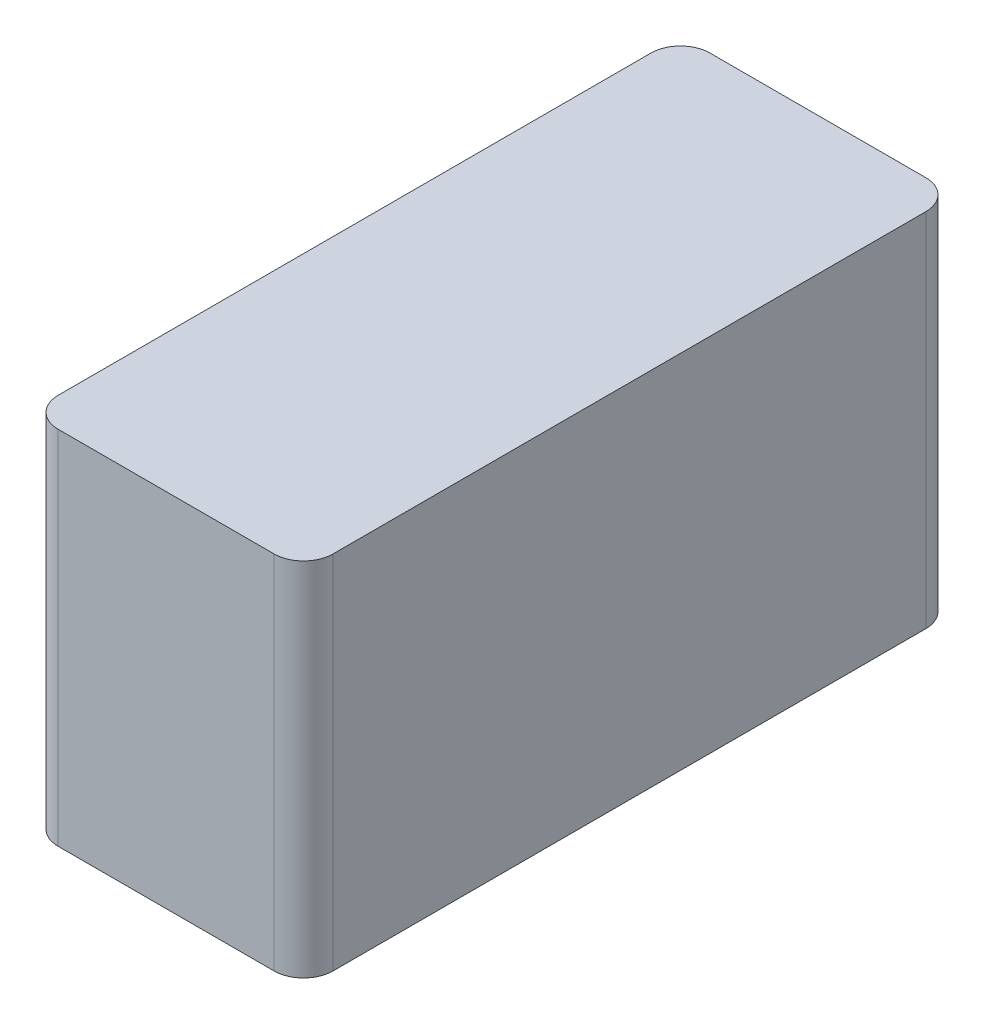
ISO-10303-21;
HEADER;
FILE_DESCRIPTION(('STEP AP214'),'2;1');
FILE_NAME('part.step','',(''),(''),'','','');
FILE_SCHEMA(('AUTOMOTIVE_DESIGN { 1 0 10303 214 1 1 1 1 }'));
ENDSEC;
DATA;
#1=APPLICATION_CONTEXT('core data for automotive mechanical design processes');
#2=APPLICATION_PROTOCOL_DEFINITION('international standard','automotive_design',2000,#1);
#3=PRODUCT_CONTEXT('',#1,'mechanical');
#4=PRODUCT('Part','Part','',(#3));
#5=PRODUCT_RELATED_PRODUCT_CATEGORY('part','',(#4));
#6=PRODUCT_DEFINITION_FORMATION('','',#4);
#7=PRODUCT_DEFINITION_CONTEXT('part definition',#1,'design');
#8=PRODUCT_DEFINITION('design','',#6,#7);
#9=PRODUCT_DEFINITION_SHAPE('','',#8);
#10=(LENGTH_UNIT() NAMED_UNIT(*) SI_UNIT(.MILLI.,.METRE.));
#11=(NAMED_UNIT(*) PLANE_ANGLE_UNIT() SI_UNIT($,.RADIAN.));
#12=(NAMED_UNIT(*) SI_UNIT($,.STERADIAN.) SOLID_ANGLE_UNIT());
#13=UNCERTAINTY_MEASURE_WITH_UNIT(LENGTH_MEASURE(1.E-05),#10,'distance_accuracy_value','');
#14=(GEOMETRIC_REPRESENTATION_CONTEXT(3) GLOBAL_UNCERTAINTY_ASSIGNED_CONTEXT((#13)) GLOBAL_UNIT_ASSIGNED_CONTEXT((#10,
#11,#12)) REPRESENTATION_CONTEXT('',''));
#15=CARTESIAN_POINT('',(0.,0.,0.));
#16=DIRECTION('',(0.,0.,1.));
#17=DIRECTION('',(1.,0.,0.));
#18=AXIS2_PLACEMENT_3D('',#15,#16,#17);
#19=CARTESIAN_POINT('',(140.,0.,0.));
#20=DIRECTION('',(0.,0.,-1.));
#21=DIRECTION('',(0.,1.,0.));
#22=AXIS2_PLACEMENT_3D('',#19,#20,#21);
#23=PLANE('',#22);
#24=DIRECTION('',(-1.,0.,0.));
#25=VECTOR('',#24,1.);
#26=CARTESIAN_POINT('',(140.,-184.,0.));
#27=LINE('',#26,#25);
#28=CARTESIAN_POINT('',(125.,-184.,0.));
#29=VERTEX_POINT('',#28);
#30=CARTESIAN_POINT('',(15.,-184.,0.));
#31=VERTEX_POINT('',#30);
#32=EDGE_CURVE('E128',#29,#31,#27,.T.);
#33=ORIENTED_EDGE('',*,*,#32,.F.);
#34=DIRECTION('',(0.,-1.,0.));
#35=VECTOR('',#34,1.);
#36=CARTESIAN_POINT('',(125.,0.,0.));
#37=LINE('',#36,#35);
#38=CARTESIAN_POINT('',(125.,0.,0.));
#39=VERTEX_POINT('',#38);
#40=EDGE_CURVE('E11',#29,#39,#37,.F.);
#41=ORIENTED_EDGE('',*,*,#40,.T.);
#42=DIRECTION('',(-1.,0.,0.));
#43=VECTOR('',#42,1.);
#44=CARTESIAN_POINT('',(140.,0.,0.));
#45=LINE('',#44,#43);
#46=CARTESIAN_POINT('',(15.,0.,0.));
#47=VERTEX_POINT('',#46);
#48=EDGE_CURVE('E123',#39,#47,#45,.T.);
#49=ORIENTED_EDGE('',*,*,#48,.T.);
#50=DIRECTION('',(0.,-1.,0.));
#51=VECTOR('',#50,1.);
#52=CARTESIAN_POINT('',(15.,0.,0.));
#53=LINE('',#52,#51);
#54=EDGE_CURVE('E43',#47,#31,#53,.T.);
#55=ORIENTED_EDGE('',*,*,#54,.T.);
#56=EDGE_LOOP('',(#33,#41,#49,#55));
#57=FACE_BOUND('',#56,.T.);
#58=ADVANCED_FACE('F35',(#57),#23,.F.);
#59=CARTESIAN_POINT('',(140.,-184.,0.));
#60=DIRECTION('',(0.,1.,0.));
#61=DIRECTION('',(0.,0.,1.));
#62=AXIS2_PLACEMENT_3D('',#59,#60,#61);
#63=PLANE('',#62);
#64=DIRECTION('',(0.,0.,-1.));
#65=VECTOR('',#64,1.);
#66=CARTESIAN_POINT('',(0.,-184.,0.));
#67=LINE('',#66,#65);
#68=CARTESIAN_POINT('',(0.,-184.,-15.));
#69=VERTEX_POINT('',#68);
#70=CARTESIAN_POINT('',(0.,-184.,-317.));
#71=VERTEX_POINT('',#70);
#72=EDGE_CURVE('E159',#69,#71,#67,.T.);
#73=ORIENTED_EDGE('',*,*,#72,.T.);
#74=CARTESIAN_POINT('',(15.,-184.,-317.));
#75=DIRECTION('',(0.,1.,0.));
#76=DIRECTION('',(0.,0.,1.));
#77=AXIS2_PLACEMENT_3D('',#74,#75,#76);
#78=CIRCLE('',#77,15.);
#79=CARTESIAN_POINT('',(15.,-184.,-332.));
#80=VERTEX_POINT('',#79);
#81=EDGE_CURVE('E145',#71,#80,#78,.F.);
#82=ORIENTED_EDGE('',*,*,#81,.T.);
#83=DIRECTION('',(-1.,0.,0.));
#84=VECTOR('',#83,1.);
#85=CARTESIAN_POINT('',(140.,-184.,-332.));
#86=LINE('',#85,#84);
#87=CARTESIAN_POINT('',(125.,-184.,-332.));
#88=VERTEX_POINT('',#87);
#89=EDGE_CURVE('E122',#88,#80,#86,.T.);
#90=ORIENTED_EDGE('',*,*,#89,.F.);
#91=CARTESIAN_POINT('',(125.,-184.,-317.));
#92=DIRECTION('',(0.,1.,0.));
#93=DIRECTION('',(0.,0.,1.));
#94=AXIS2_PLACEMENT_3D('',#91,#92,#93);
#95=CIRCLE('',#94,15.);
#96=CARTESIAN_POINT('',(140.,-184.,-317.));
#97=VERTEX_POINT('',#96);
#98=EDGE_CURVE('E127',#88,#97,#95,.F.);
#99=ORIENTED_EDGE('',*,*,#98,.T.);
#100=DIRECTION('',(0.,0.,-1.));
#101=VECTOR('',#100,1.);
#102=CARTESIAN_POINT('',(140.,-184.,0.));
#103=LINE('',#102,#101);
#104=CARTESIAN_POINT('',(140.,-184.,-15.));
#105=VERTEX_POINT('',#104);
#106=EDGE_CURVE('E169',#105,#97,#103,.T.);
#107=ORIENTED_EDGE('',*,*,#106,.F.);
#108=CARTESIAN_POINT('',(125.,-184.,-15.));
#109=DIRECTION('',(0.,1.,0.));
#110=DIRECTION('',(0.,0.,1.));
#111=AXIS2_PLACEMENT_3D('',#108,#109,#110);
#112=CIRCLE('',#111,15.);
#113=EDGE_CURVE('E58',#105,#29,#112,.F.);
#114=ORIENTED_EDGE('',*,*,#113,.T.);
#115=ORIENTED_EDGE('',*,*,#32,.T.);
#116=CARTESIAN_POINT('',(15.,-184.,-15.));
#117=DIRECTION('',(0.,1.,0.));
#118=DIRECTION('',(0.,0.,1.));
#119=AXIS2_PLACEMENT_3D('',#116,#117,#118);
#120=CIRCLE('',#119,15.);
#121=EDGE_CURVE('E50',#31,#69,#120,.F.);
#122=ORIENTED_EDGE('',*,*,#121,.T.);
#123=EDGE_LOOP('',(#73,#82,#90,#99,#107,#114,#115,#122));
#124=FACE_BOUND('',#123,.T.);
#125=ADVANCED_FACE('F157',(#124),#63,.F.);
#126=CARTESIAN_POINT('',(140.,0.,-332.));
#127=DIRECTION('',(0.,0.,1.));
#128=DIRECTION('',(1.,0.,0.));
#129=AXIS2_PLACEMENT_3D('',#126,#127,#128);
#130=PLANE('',#129);
#131=ORIENTED_EDGE('',*,*,#89,.T.);
#132=DIRECTION('',(0.,1.,0.));
#133=VECTOR('',#132,1.);
#134=CARTESIAN_POINT('',(15.,0.,-332.));
#135=LINE('',#134,#133);
#136=CARTESIAN_POINT('',(15.,0.,-332.));
#137=VERTEX_POINT('',#136);
#138=EDGE_CURVE('E121',#80,#137,#135,.T.);
#139=ORIENTED_EDGE('',*,*,#138,.T.);
#140=DIRECTION('',(-1.,0.,0.));
#141=VECTOR('',#140,1.);
#142=CARTESIAN_POINT('',(140.,0.,-332.));
#143=LINE('',#142,#141);
#144=CARTESIAN_POINT('',(125.,0.,-332.));
#145=VERTEX_POINT('',#144);
#146=EDGE_CURVE('E104',#145,#137,#143,.T.);
#147=ORIENTED_EDGE('',*,*,#146,.F.);
#148=DIRECTION('',(0.,1.,0.));
#149=VECTOR('',#148,1.);
#150=CARTESIAN_POINT('',(125.,-184.,-332.));
#151=LINE('',#150,#149);
#152=EDGE_CURVE('E118',#145,#88,#151,.F.);
#153=ORIENTED_EDGE('',*,*,#152,.T.);
#154=EDGE_LOOP('',(#131,#139,#147,#153));
#155=FACE_BOUND('',#154,.T.);
#156=ADVANCED_FACE('F117',(#155),#130,.F.);
#157=CARTESIAN_POINT('',(140.,0.,0.));
#158=DIRECTION('',(0.,-1.,0.));
#159=DIRECTION('',(0.,0.,-1.));
#160=AXIS2_PLACEMENT_3D('',#157,#158,#159);
#161=PLANE('',#160);
#162=ORIENTED_EDGE('',*,*,#146,.T.);
#163=CARTESIAN_POINT('',(15.,0.,-317.));
#164=DIRECTION('',(0.,-1.,0.));
#165=DIRECTION('',(0.,0.,-1.));
#166=AXIS2_PLACEMENT_3D('',#163,#164,#165);
#167=CIRCLE('',#166,15.);
#168=CARTESIAN_POINT('',(0.,0.,-317.));
#169=VERTEX_POINT('',#168);
#170=EDGE_CURVE('E111',#137,#169,#167,.F.);
#171=ORIENTED_EDGE('',*,*,#170,.T.);
#172=DIRECTION('',(0.,0.,1.));
#173=VECTOR('',#172,1.);
#174=CARTESIAN_POINT('',(0.,0.,0.));
#175=LINE('',#174,#173);
#176=CARTESIAN_POINT('',(0.,0.,-15.));
#177=VERTEX_POINT('',#176);
#178=EDGE_CURVE('E166',#169,#177,#175,.T.);
#179=ORIENTED_EDGE('',*,*,#178,.T.);
#180=CARTESIAN_POINT('',(15.,0.,-15.));
#181=DIRECTION('',(0.,-1.,0.));
#182=DIRECTION('',(0.,0.,-1.));
#183=AXIS2_PLACEMENT_3D('',#180,#181,#182);
#184=CIRCLE('',#183,15.);
#185=EDGE_CURVE('E130',#177,#47,#184,.F.);
#186=ORIENTED_EDGE('',*,*,#185,.T.);
#187=ORIENTED_EDGE('',*,*,#48,.F.);
#188=CARTESIAN_POINT('',(125.,0.,-15.));
#189=DIRECTION('',(0.,-1.,0.));
#190=DIRECTION('',(0.,0.,-1.));
#191=AXIS2_PLACEMENT_3D('',#188,#189,#190);
#192=CIRCLE('',#191,15.);
#193=CARTESIAN_POINT('',(140.,0.,-15.));
#194=VERTEX_POINT('',#193);
#195=EDGE_CURVE('E112',#39,#194,#192,.F.);
#196=ORIENTED_EDGE('',*,*,#195,.T.);
#197=DIRECTION('',(0.,0.,1.));
#198=VECTOR('',#197,1.);
#199=CARTESIAN_POINT('',(140.,0.,0.));
#200=LINE('',#199,#198);
#201=CARTESIAN_POINT('',(140.,0.,-317.));
#202=VERTEX_POINT('',#201);
#203=EDGE_CURVE('E106',#202,#194,#200,.T.);
#204=ORIENTED_EDGE('',*,*,#203,.F.);
#205=CARTESIAN_POINT('',(125.,0.,-317.));
#206=DIRECTION('',(0.,-1.,0.));
#207=DIRECTION('',(0.,0.,-1.));
#208=AXIS2_PLACEMENT_3D('',#205,#206,#207);
#209=CIRCLE('',#208,15.);
#210=EDGE_CURVE('E101',#202,#145,#209,.F.);
#211=ORIENTED_EDGE('',*,*,#210,.T.);
#212=EDGE_LOOP('',(#162,#171,#179,#186,#187,#196,#204,#211));
#213=FACE_BOUND('',#212,.T.);
#214=ADVANCED_FACE('F103',(#213),#161,.F.);
#215=CARTESIAN_POINT('',(140.,0.,0.));
#216=DIRECTION('',(1.,0.,0.));
#217=DIRECTION('',(0.,0.,-1.));
#218=AXIS2_PLACEMENT_3D('',#215,#216,#217);
#219=PLANE('',#218);
#220=ORIENTED_EDGE('',*,*,#106,.T.);
#221=DIRECTION('',(0.,1.,0.));
#222=VECTOR('',#221,1.);
#223=CARTESIAN_POINT('',(140.,0.,-317.));
#224=LINE('',#223,#222);
#225=EDGE_CURVE('E150',#97,#202,#224,.T.);
#226=ORIENTED_EDGE('',*,*,#225,.T.);
#227=ORIENTED_EDGE('',*,*,#203,.T.);
#228=DIRECTION('',(0.,-1.,0.));
#229=VECTOR('',#228,1.);
#230=CARTESIAN_POINT('',(140.,-184.,-15.));
#231=LINE('',#230,#229);
#232=EDGE_CURVE('E147',#194,#105,#231,.T.);
#233=ORIENTED_EDGE('',*,*,#232,.T.);
#234=EDGE_LOOP('',(#220,#226,#227,#233));
#235=FACE_BOUND('',#234,.T.);
#236=ADVANCED_FACE('F185',(#235),#219,.T.);
#237=CARTESIAN_POINT('',(0.,0.,0.));
#238=DIRECTION('',(1.,0.,0.));
#239=DIRECTION('',(0.,0.,-1.));
#240=AXIS2_PLACEMENT_3D('',#237,#238,#239);
#241=PLANE('',#240);
#242=ORIENTED_EDGE('',*,*,#178,.F.);
#243=DIRECTION('',(0.,1.,0.));
#244=VECTOR('',#243,1.);
#245=CARTESIAN_POINT('',(0.,0.,-317.));
#246=LINE('',#245,#244);
#247=EDGE_CURVE('E140',#169,#71,#246,.F.);
#248=ORIENTED_EDGE('',*,*,#247,.T.);
#249=ORIENTED_EDGE('',*,*,#72,.F.);
#250=DIRECTION('',(0.,-1.,0.));
#251=VECTOR('',#250,1.);
#252=CARTESIAN_POINT('',(0.,0.,-15.));
#253=LINE('',#252,#251);
#254=EDGE_CURVE('E138',#69,#177,#253,.F.);
#255=ORIENTED_EDGE('',*,*,#254,.T.);
#256=EDGE_LOOP('',(#242,#248,#249,#255));
#257=FACE_BOUND('',#256,.T.);
#258=ADVANCED_FACE('F163',(#257),#241,.F.);
#259=CARTESIAN_POINT('',(15.,0.,-317.));
#260=DIRECTION('',(0.,1.,0.));
#261=DIRECTION('',(0.,0.,1.));
#262=AXIS2_PLACEMENT_3D('',#259,#260,#261);
#263=CYLINDRICAL_SURFACE('',#262,15.);
#264=ORIENTED_EDGE('',*,*,#81,.F.);
#265=ORIENTED_EDGE('',*,*,#247,.F.);
#266=ORIENTED_EDGE('',*,*,#170,.F.);
#267=ORIENTED_EDGE('',*,*,#138,.F.);
#268=EDGE_LOOP('',(#264,#265,#266,#267));
#269=FACE_BOUND('',#268,.T.);
#270=ADVANCED_FACE('F176',(#269),#263,.T.);
#271=CARTESIAN_POINT('',(125.,0.,-317.));
#272=DIRECTION('',(0.,-1.,0.));
#273=DIRECTION('',(0.,0.,-1.));
#274=AXIS2_PLACEMENT_3D('',#271,#272,#273);
#275=CYLINDRICAL_SURFACE('',#274,15.);
#276=ORIENTED_EDGE('',*,*,#98,.F.);
#277=ORIENTED_EDGE('',*,*,#152,.F.);
#278=ORIENTED_EDGE('',*,*,#210,.F.);
#279=ORIENTED_EDGE('',*,*,#225,.F.);
#280=EDGE_LOOP('',(#276,#277,#278,#279));
#281=FACE_BOUND('',#280,.T.);
#282=ADVANCED_FACE('F126',(#281),#275,.T.);
#283=CARTESIAN_POINT('',(125.,0.,-15.));
#284=DIRECTION('',(0.,1.,0.));
#285=DIRECTION('',(0.,0.,1.));
#286=AXIS2_PLACEMENT_3D('',#283,#284,#285);
#287=CYLINDRICAL_SURFACE('',#286,15.);
#288=ORIENTED_EDGE('',*,*,#195,.F.);
#289=ORIENTED_EDGE('',*,*,#40,.F.);
#290=ORIENTED_EDGE('',*,*,#113,.F.);
#291=ORIENTED_EDGE('',*,*,#232,.F.);
#292=EDGE_LOOP('',(#288,#289,#290,#291));
#293=FACE_BOUND('',#292,.T.);
#294=ADVANCED_FACE('F183',(#293),#287,.T.);
#295=CARTESIAN_POINT('',(15.,0.,-15.));
#296=DIRECTION('',(0.,-1.,0.));
#297=DIRECTION('',(0.,0.,-1.));
#298=AXIS2_PLACEMENT_3D('',#295,#296,#297);
#299=CYLINDRICAL_SURFACE('',#298,15.);
#300=ORIENTED_EDGE('',*,*,#185,.F.);
#301=ORIENTED_EDGE('',*,*,#254,.F.);
#302=ORIENTED_EDGE('',*,*,#121,.F.);
#303=ORIENTED_EDGE('',*,*,#54,.F.);
#304=EDGE_LOOP('',(#300,#301,#302,#303));
#305=FACE_BOUND('',#304,.T.);
#306=ADVANCED_FACE('F37',(#305),#299,.T.);
#307=CLOSED_SHELL('',(#58,#125,#156,#214,#236,#258,#270,#282,#294,#306));
#308=MANIFOLD_SOLID_BREP('B2',#307);
#309=ADVANCED_BREP_SHAPE_REPRESENTATION('',(#18,#308),#14);
#310=SHAPE_DEFINITION_REPRESENTATION(#9,#309);
ENDSEC;
END-ISO-10303-21;
